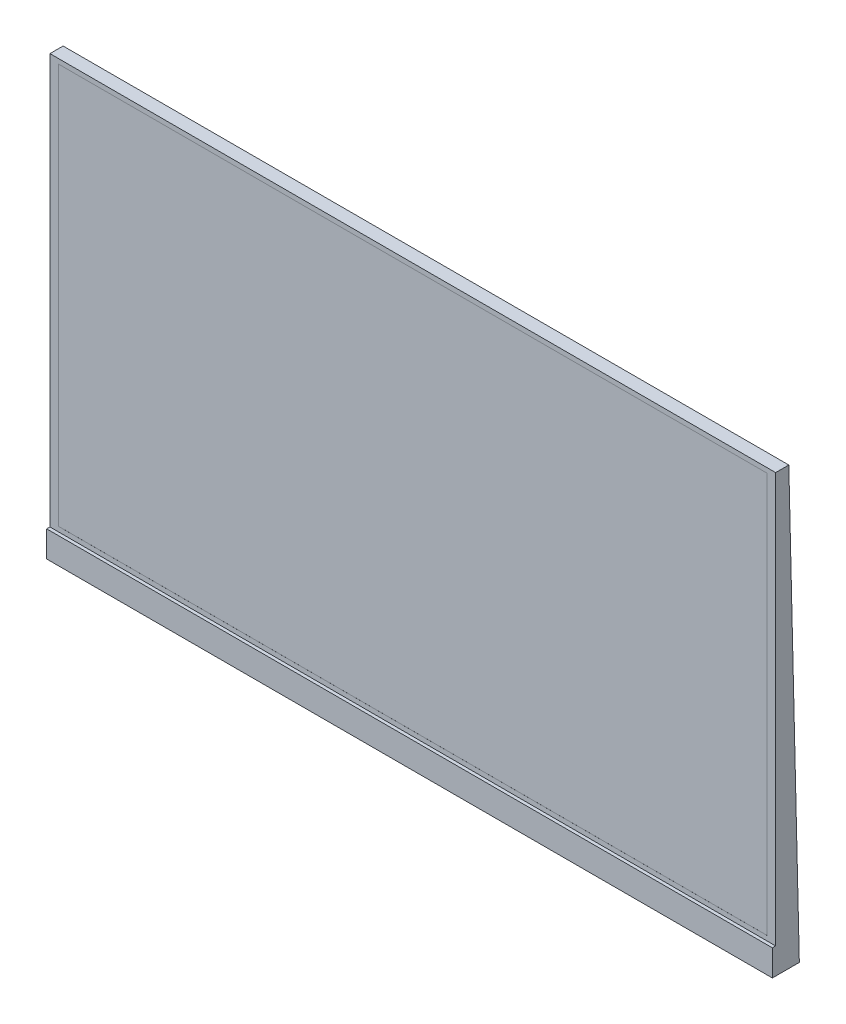
ISO-10303-21;
HEADER;
FILE_DESCRIPTION(('STEP AP214'),'2;1');
FILE_NAME('part.step','',(''),(''),'','','');
FILE_SCHEMA(('AUTOMOTIVE_DESIGN { 1 0 10303 214 1 1 1 1 }'));
ENDSEC;
DATA;
#1=APPLICATION_CONTEXT('core data for automotive mechanical design processes');
#2=APPLICATION_PROTOCOL_DEFINITION('international standard','automotive_design',2000,#1);
#3=PRODUCT_CONTEXT('',#1,'mechanical');
#4=PRODUCT('Part','Part','',(#3));
#5=PRODUCT_RELATED_PRODUCT_CATEGORY('part','',(#4));
#6=PRODUCT_DEFINITION_FORMATION('','',#4);
#7=PRODUCT_DEFINITION_CONTEXT('part definition',#1,'design');
#8=PRODUCT_DEFINITION('design','',#6,#7);
#9=PRODUCT_DEFINITION_SHAPE('','',#8);
#10=(LENGTH_UNIT() NAMED_UNIT(*) SI_UNIT(.MILLI.,.METRE.));
#11=(NAMED_UNIT(*) PLANE_ANGLE_UNIT() SI_UNIT($,.RADIAN.));
#12=(NAMED_UNIT(*) SI_UNIT($,.STERADIAN.) SOLID_ANGLE_UNIT());
#13=UNCERTAINTY_MEASURE_WITH_UNIT(LENGTH_MEASURE(1.E-05),#10,'distance_accuracy_value','');
#14=(GEOMETRIC_REPRESENTATION_CONTEXT(3) GLOBAL_UNCERTAINTY_ASSIGNED_CONTEXT((#13)) GLOBAL_UNIT_ASSIGNED_CONTEXT((#10,
#11,#12)) REPRESENTATION_CONTEXT('',''));
#15=CARTESIAN_POINT('',(0.,0.,0.));
#16=DIRECTION('',(0.,0.,1.));
#17=DIRECTION('',(1.,0.,0.));
#18=AXIS2_PLACEMENT_3D('',#15,#16,#17);
#19=CARTESIAN_POINT('',(269.478125,-161.925,9.525));
#20=DIRECTION('',(-1.,0.,0.));
#21=DIRECTION('',(0.,0.,1.));
#22=AXIS2_PLACEMENT_3D('',#19,#20,#21);
#23=PLANE('',#22);
#24=DIRECTION('',(0.,0.999709445349068,0.0241044576761122));
#25=VECTOR('',#24,1.);
#26=CARTESIAN_POINT('',(269.478125,161.925,-0.253999999999999));
#27=LINE('',#26,#25);
#28=CARTESIAN_POINT('',(269.478125,-161.925,-8.06249741364926));
#29=VERTEX_POINT('',#28);
#30=CARTESIAN_POINT('',(269.478125,161.925,-0.253999999999999));
#31=VERTEX_POINT('',#30);
#32=EDGE_CURVE('E229',#29,#31,#27,.T.);
#33=ORIENTED_EDGE('',*,*,#32,.T.);
#34=DIRECTION('',(0.,0.,-1.));
#35=VECTOR('',#34,1.);
#36=CARTESIAN_POINT('',(269.478125,161.925,9.525));
#37=LINE('',#36,#35);
#38=CARTESIAN_POINT('',(269.478125,161.925,9.525));
#39=VERTEX_POINT('',#38);
#40=EDGE_CURVE('E258',#39,#31,#37,.T.);
#41=ORIENTED_EDGE('',*,*,#40,.F.);
#42=DIRECTION('',(0.,1.,0.));
#43=VECTOR('',#42,1.);
#44=CARTESIAN_POINT('',(269.478125,-161.925,9.525));
#45=LINE('',#44,#43);
#46=CARTESIAN_POINT('',(269.478125,-142.5194,9.525));
#47=VERTEX_POINT('',#46);
#48=EDGE_CURVE('E245',#47,#39,#45,.T.);
#49=ORIENTED_EDGE('',*,*,#48,.F.);
#50=DIRECTION('',(0.,0.,1.));
#51=VECTOR('',#50,1.);
#52=CARTESIAN_POINT('',(269.478125,-142.5194,11.9527025863507));
#53=LINE('',#52,#51);
#54=CARTESIAN_POINT('',(269.478125,-142.5194,11.9527025863507));
#55=VERTEX_POINT('',#54);
#56=EDGE_CURVE('E215',#47,#55,#53,.T.);
#57=ORIENTED_EDGE('',*,*,#56,.T.);
#58=DIRECTION('',(0.,-1.,0.));
#59=VECTOR('',#58,1.);
#60=CARTESIAN_POINT('',(269.478125,-161.925,11.9527025863507));
#61=LINE('',#60,#59);
#62=CARTESIAN_POINT('',(269.478125,-161.925,11.9527025863507));
#63=VERTEX_POINT('',#62);
#64=EDGE_CURVE('E226',#55,#63,#61,.T.);
#65=ORIENTED_EDGE('',*,*,#64,.T.);
#66=DIRECTION('',(0.,0.,-1.));
#67=VECTOR('',#66,1.);
#68=CARTESIAN_POINT('',(269.478125,-161.925,9.525));
#69=LINE('',#68,#67);
#70=EDGE_CURVE('E251',#63,#29,#69,.T.);
#71=ORIENTED_EDGE('',*,*,#70,.T.);
#72=EDGE_LOOP('',(#33,#41,#49,#57,#65,#71));
#73=FACE_BOUND('',#72,.T.);
#74=ADVANCED_FACE('F35',(#73),#23,.F.);
#75=CARTESIAN_POINT('',(-269.478125,-161.925,9.525));
#76=DIRECTION('',(1.,0.,0.));
#77=DIRECTION('',(0.,0.,-1.));
#78=AXIS2_PLACEMENT_3D('',#75,#76,#77);
#79=PLANE('',#78);
#80=DIRECTION('',(0.,-0.999709445349068,-0.0241044576761122));
#81=VECTOR('',#80,1.);
#82=CARTESIAN_POINT('',(-269.478125,161.925,-0.253999999999999));
#83=LINE('',#82,#81);
#84=CARTESIAN_POINT('',(-269.478125,161.925,-0.253999999999999));
#85=VERTEX_POINT('',#84);
#86=CARTESIAN_POINT('',(-269.478125,-161.925,-8.06249741364926));
#87=VERTEX_POINT('',#86);
#88=EDGE_CURVE('E220',#85,#87,#83,.T.);
#89=ORIENTED_EDGE('',*,*,#88,.T.);
#90=DIRECTION('',(0.,0.,-1.));
#91=VECTOR('',#90,1.);
#92=CARTESIAN_POINT('',(-269.478125,-161.925,9.525));
#93=LINE('',#92,#91);
#94=CARTESIAN_POINT('',(-269.478125,-161.925,11.9527025863507));
#95=VERTEX_POINT('',#94);
#96=EDGE_CURVE('E253',#95,#87,#93,.T.);
#97=ORIENTED_EDGE('',*,*,#96,.F.);
#98=DIRECTION('',(0.,1.,0.));
#99=VECTOR('',#98,1.);
#100=CARTESIAN_POINT('',(-269.478125,-161.925,11.9527025863507));
#101=LINE('',#100,#99);
#102=CARTESIAN_POINT('',(-269.478125,-142.5194,11.9527025863507));
#103=VERTEX_POINT('',#102);
#104=EDGE_CURVE('E218',#95,#103,#101,.T.);
#105=ORIENTED_EDGE('',*,*,#104,.T.);
#106=DIRECTION('',(0.,0.,-1.));
#107=VECTOR('',#106,1.);
#108=CARTESIAN_POINT('',(-269.478125,-142.5194,11.9527025863507));
#109=LINE('',#108,#107);
#110=CARTESIAN_POINT('',(-269.478125,-142.5194,9.525));
#111=VERTEX_POINT('',#110);
#112=EDGE_CURVE('E223',#103,#111,#109,.T.);
#113=ORIENTED_EDGE('',*,*,#112,.T.);
#114=DIRECTION('',(0.,-1.,0.));
#115=VECTOR('',#114,1.);
#116=CARTESIAN_POINT('',(-269.478125,-161.925,9.525));
#117=LINE('',#116,#115);
#118=CARTESIAN_POINT('',(-269.478125,161.925,9.525));
#119=VERTEX_POINT('',#118);
#120=EDGE_CURVE('E249',#119,#111,#117,.T.);
#121=ORIENTED_EDGE('',*,*,#120,.F.);
#122=DIRECTION('',(0.,0.,-1.));
#123=VECTOR('',#122,1.);
#124=CARTESIAN_POINT('',(-269.478125,161.925,9.525));
#125=LINE('',#124,#123);
#126=EDGE_CURVE('E256',#119,#85,#125,.T.);
#127=ORIENTED_EDGE('',*,*,#126,.T.);
#128=EDGE_LOOP('',(#89,#97,#105,#113,#121,#127));
#129=FACE_BOUND('',#128,.T.);
#130=ADVANCED_FACE('F340',(#129),#79,.F.);
#131=CARTESIAN_POINT('',(-437.651403620272,78.3717,-37.1935923327215));
#132=DIRECTION('',(0.,0.995848241580805,-0.0910290049402883));
#133=DIRECTION('',(0.,0.0910290049402883,0.995848241580805));
#134=AXIS2_PLACEMENT_3D('',#131,#132,#133);
#135=PLANE('',#134);
#136=CARTESIAN_POINT('',(-158.765875,79.8255081958881,-21.2890755644605));
#137=DIRECTION('',(0.,0.995848241580805,-0.0910290049402883));
#138=DIRECTION('',(0.,0.0910290049402883,0.995848241580805));
#139=AXIS2_PLACEMENT_3D('',#136,#137,#138);
#140=ELLIPSE('',#139,19.177247008656,19.05);
#141=CARTESIAN_POINT('',(-139.715875,79.8255081958881,-21.2890755644605));
#142=VERTEX_POINT('',#141);
#143=CARTESIAN_POINT('',(-139.842277685109,80.0262741641194,-19.0927158814835));
#144=VERTEX_POINT('',#143);
#145=EDGE_CURVE('E284',#142,#144,#140,.F.);
#146=ORIENTED_EDGE('',*,*,#145,.T.);
#147=DIRECTION('',(1.,0.,0.));
#148=VECTOR('',#147,1.);
#149=CARTESIAN_POINT('',(139.684125,80.0262741641194,-19.0927158814835));
#150=LINE('',#149,#148);
#151=CARTESIAN_POINT('',(139.810527685109,80.0262741641194,-19.0927158814835));
#152=VERTEX_POINT('',#151);
#153=EDGE_CURVE('E59',#144,#152,#150,.T.);
#154=ORIENTED_EDGE('',*,*,#153,.T.);
#155=CARTESIAN_POINT('',(158.734125,79.8255081958881,-21.2890755644605));
#156=DIRECTION('',(0.,0.995848241580805,-0.0910290049402883));
#157=DIRECTION('',(0.,-0.0910290049402883,-0.995848241580805));
#158=AXIS2_PLACEMENT_3D('',#155,#156,#157);
#159=ELLIPSE('',#158,19.177247008656,19.05);
#160=CARTESIAN_POINT('',(139.684125,79.8255081958881,-21.2890755644605));
#161=VERTEX_POINT('',#160);
#162=EDGE_CURVE('E11',#152,#161,#159,.F.);
#163=ORIENTED_EDGE('',*,*,#162,.T.);
#164=DIRECTION('',(0.,0.0910290049402883,0.995848241580805));
#165=VECTOR('',#164,1.);
#166=CARTESIAN_POINT('',(139.684125,78.3717,-37.1935923327215));
#167=LINE('',#166,#165);
#168=CARTESIAN_POINT('',(139.684125,78.3717,-37.1935923327215));
#169=VERTEX_POINT('',#168);
#170=EDGE_CURVE('E208',#169,#161,#167,.T.);
#171=ORIENTED_EDGE('',*,*,#170,.F.);
#172=DIRECTION('',(1.,0.,0.));
#173=VECTOR('',#172,1.);
#174=CARTESIAN_POINT('',(-437.651403620272,78.3717,-37.1935923327215));
#175=LINE('',#174,#173);
#176=CARTESIAN_POINT('',(-139.715875,78.3717,-37.1935923327215));
#177=VERTEX_POINT('',#176);
#178=EDGE_CURVE('E212',#177,#169,#175,.T.);
#179=ORIENTED_EDGE('',*,*,#178,.F.);
#180=DIRECTION('',(0.,0.0910290049402883,0.995848241580805));
#181=VECTOR('',#180,1.);
#182=CARTESIAN_POINT('',(-139.715875,78.3717,-37.1935923327215));
#183=LINE('',#182,#181);
#184=EDGE_CURVE('E203',#177,#142,#183,.T.);
#185=ORIENTED_EDGE('',*,*,#184,.T.);
#186=EDGE_LOOP('',(#146,#154,#163,#171,#179,#185));
#187=FACE_BOUND('',#186,.T.);
#188=ADVANCED_FACE('F307',(#187),#135,.T.);
#189=CARTESIAN_POINT('',(-437.651403620272,78.3717,-37.1935923327215));
#190=DIRECTION('',(0.,-0.00388871893515446,-0.999992438903937));
#191=DIRECTION('',(0.,0.999992438903937,-0.00388871893515447));
#192=AXIS2_PLACEMENT_3D('',#189,#190,#191);
#193=PLANE('',#192);
#194=DIRECTION('',(0.,0.999992438903937,-0.00388871893515447));
#195=VECTOR('',#194,1.);
#196=CARTESIAN_POINT('',(139.684125,78.3716999999998,-37.1935923327215));
#197=LINE('',#196,#195);
#198=CARTESIAN_POINT('',(139.684125,-80.3770996759999,-36.5762582017657));
#199=VERTEX_POINT('',#198);
#200=EDGE_CURVE('E206',#199,#169,#197,.T.);
#201=ORIENTED_EDGE('',*,*,#200,.F.);
#202=DIRECTION('',(1.,0.,0.));
#203=VECTOR('',#202,1.);
#204=CARTESIAN_POINT('',(-437.651403620272,-80.3770996759999,-36.5762582017657));
#205=LINE('',#204,#203);
#206=CARTESIAN_POINT('',(-139.715875,-80.3770996759999,-36.5762582017657));
#207=VERTEX_POINT('',#206);
#208=EDGE_CURVE('E211',#207,#199,#205,.T.);
#209=ORIENTED_EDGE('',*,*,#208,.F.);
#210=DIRECTION('',(0.,0.999992438903937,-0.00388871893515447));
#211=VECTOR('',#210,1.);
#212=CARTESIAN_POINT('',(-139.715875,78.3716999999999,-37.1935923327215));
#213=LINE('',#212,#211);
#214=EDGE_CURVE('E200',#207,#177,#213,.T.);
#215=ORIENTED_EDGE('',*,*,#214,.T.);
#216=ORIENTED_EDGE('',*,*,#178,.T.);
#217=EDGE_LOOP('',(#201,#209,#215,#216));
#218=FACE_BOUND('',#217,.T.);
#219=ADVANCED_FACE('F315',(#218),#193,.T.);
#220=CARTESIAN_POINT('',(-437.651403620272,-80.3770996759999,-36.5762582017657));
#221=DIRECTION('',(0.,-0.996526089955066,-0.0832811625691415));
#222=DIRECTION('',(0.,0.0832811625691415,-0.996526089955066));
#223=AXIS2_PLACEMENT_3D('',#220,#221,#222);
#224=PLANE('',#223);
#225=DIRECTION('',(0.,0.0832811625691415,-0.996526089955066));
#226=VECTOR('',#225,1.);
#227=CARTESIAN_POINT('',(139.684125,-80.3770996759999,-36.5762582017657));
#228=LINE('',#227,#226);
#229=CARTESIAN_POINT('',(139.684125,-81.3299390109497,-25.1747692272985));
#230=VERTEX_POINT('',#229);
#231=EDGE_CURVE('E263',#230,#199,#228,.T.);
#232=ORIENTED_EDGE('',*,*,#231,.F.);
#233=CARTESIAN_POINT('',(158.734125,-81.3299390109497,-25.1747692272985));
#234=DIRECTION('',(0.,-0.996526089955066,-0.0832811625691415));
#235=DIRECTION('',(0.,-0.0832811625691415,0.996526089955066));
#236=AXIS2_PLACEMENT_3D('',#233,#234,#235);
#237=ELLIPSE('',#236,19.0835107990965,19.05);
#238=CARTESIAN_POINT('',(139.717576953863,-81.4240829935834,-24.0482607587248));
#239=VERTEX_POINT('',#238);
#240=EDGE_CURVE('E44',#230,#239,#237,.F.);
#241=ORIENTED_EDGE('',*,*,#240,.T.);
#242=DIRECTION('',(1.,0.,0.));
#243=VECTOR('',#242,1.);
#244=CARTESIAN_POINT('',(-139.715875,-81.4240829935834,-24.0482607587248));
#245=LINE('',#244,#243);
#246=CARTESIAN_POINT('',(-139.749326953863,-81.4240829935834,-24.0482607587248));
#247=VERTEX_POINT('',#246);
#248=EDGE_CURVE('E277',#239,#247,#245,.F.);
#249=ORIENTED_EDGE('',*,*,#248,.T.);
#250=CARTESIAN_POINT('',(-158.765875,-81.3299390109497,-25.1747692272985));
#251=DIRECTION('',(0.,-0.996526089955066,-0.0832811625691415));
#252=DIRECTION('',(0.,0.0832811625691415,-0.996526089955066));
#253=AXIS2_PLACEMENT_3D('',#250,#251,#252);
#254=ELLIPSE('',#253,19.0835107990965,19.05);
#255=CARTESIAN_POINT('',(-139.715875,-81.3299390109497,-25.1747692272985));
#256=VERTEX_POINT('',#255);
#257=EDGE_CURVE('E282',#247,#256,#254,.F.);
#258=ORIENTED_EDGE('',*,*,#257,.T.);
#259=DIRECTION('',(0.,0.0832811625691415,-0.996526089955066));
#260=VECTOR('',#259,1.);
#261=CARTESIAN_POINT('',(-139.715875,-80.3770996759999,-36.5762582017657));
#262=LINE('',#261,#260);
#263=EDGE_CURVE('E261',#256,#207,#262,.T.);
#264=ORIENTED_EDGE('',*,*,#263,.T.);
#265=ORIENTED_EDGE('',*,*,#208,.T.);
#266=EDGE_LOOP('',(#232,#241,#249,#258,#264,#265));
#267=FACE_BOUND('',#266,.T.);
#268=ADVANCED_FACE('F317',(#267),#224,.T.);
#269=CARTESIAN_POINT('',(-269.478125,161.925,9.525));
#270=DIRECTION('',(0.,-1.,0.));
#271=DIRECTION('',(0.,0.,-1.));
#272=AXIS2_PLACEMENT_3D('',#269,#270,#271);
#273=PLANE('',#272);
#274=ORIENTED_EDGE('',*,*,#40,.T.);
#275=DIRECTION('',(1.,0.,0.));
#276=VECTOR('',#275,1.);
#277=CARTESIAN_POINT('',(-593.946044417375,161.925,-0.253999999999999));
#278=LINE('',#277,#276);
#279=EDGE_CURVE('E221',#85,#31,#278,.T.);
#280=ORIENTED_EDGE('',*,*,#279,.F.);
#281=ORIENTED_EDGE('',*,*,#126,.F.);
#282=DIRECTION('',(-1.,0.,0.));
#283=VECTOR('',#282,1.);
#284=CARTESIAN_POINT('',(-269.478125,161.925,9.525));
#285=LINE('',#284,#283);
#286=EDGE_CURVE('E247',#39,#119,#285,.T.);
#287=ORIENTED_EDGE('',*,*,#286,.F.);
#288=EDGE_LOOP('',(#274,#280,#281,#287));
#289=FACE_BOUND('',#288,.T.);
#290=ADVANCED_FACE('F349',(#289),#273,.F.);
#291=CARTESIAN_POINT('',(-269.478125,-161.925,9.525));
#292=DIRECTION('',(0.,1.,0.));
#293=DIRECTION('',(0.,0.,1.));
#294=AXIS2_PLACEMENT_3D('',#291,#292,#293);
#295=PLANE('',#294);
#296=ORIENTED_EDGE('',*,*,#96,.T.);
#297=DIRECTION('',(1.,0.,0.));
#298=VECTOR('',#297,1.);
#299=CARTESIAN_POINT('',(-593.946044417375,-161.925,-8.06249741364926));
#300=LINE('',#299,#298);
#301=EDGE_CURVE('E234',#87,#29,#300,.T.);
#302=ORIENTED_EDGE('',*,*,#301,.T.);
#303=ORIENTED_EDGE('',*,*,#70,.F.);
#304=DIRECTION('',(1.,0.,0.));
#305=VECTOR('',#304,1.);
#306=CARTESIAN_POINT('',(-593.946044417375,-161.925,11.9527025863507));
#307=LINE('',#306,#305);
#308=EDGE_CURVE('E237',#95,#63,#307,.T.);
#309=ORIENTED_EDGE('',*,*,#308,.F.);
#310=EDGE_LOOP('',(#296,#302,#303,#309));
#311=FACE_BOUND('',#310,.T.);
#312=ADVANCED_FACE('F351',(#311),#295,.F.);
#313=CARTESIAN_POINT('',(0.,0.,9.525));
#314=DIRECTION('',(0.,0.,-1.));
#315=DIRECTION('',(-1.,0.,0.));
#316=AXIS2_PLACEMENT_3D('',#313,#314,#315);
#317=PLANE('',#316);
#318=DIRECTION('',(-1.,0.,0.));
#319=VECTOR('',#318,1.);
#320=CARTESIAN_POINT('',(-263.174603173603,158.364280701682,9.525));
#321=LINE('',#320,#319);
#322=CARTESIAN_POINT('',(263.174603173603,158.364280701682,9.525));
#323=VERTEX_POINT('',#322);
#324=CARTESIAN_POINT('',(-263.174603173603,158.364280701682,9.525));
#325=VERTEX_POINT('',#324);
#326=EDGE_CURVE('E190',#323,#325,#321,.T.);
#327=ORIENTED_EDGE('',*,*,#326,.F.);
#328=DIRECTION('',(0.,1.,0.));
#329=VECTOR('',#328,1.);
#330=CARTESIAN_POINT('',(263.174603173603,-138.958680701682,9.525));
#331=LINE('',#330,#329);
#332=CARTESIAN_POINT('',(263.174603173603,-138.958680701682,9.525));
#333=VERTEX_POINT('',#332);
#334=EDGE_CURVE('E52',#333,#323,#331,.T.);
#335=ORIENTED_EDGE('',*,*,#334,.F.);
#336=DIRECTION('',(1.,0.,0.));
#337=VECTOR('',#336,1.);
#338=CARTESIAN_POINT('',(-263.174603173603,-138.958680701682,9.525));
#339=LINE('',#338,#337);
#340=CARTESIAN_POINT('',(-263.174603173603,-138.958680701682,9.525));
#341=VERTEX_POINT('',#340);
#342=EDGE_CURVE('E181',#341,#333,#339,.T.);
#343=ORIENTED_EDGE('',*,*,#342,.F.);
#344=DIRECTION('',(0.,-1.,0.));
#345=VECTOR('',#344,1.);
#346=CARTESIAN_POINT('',(-263.174603173603,-138.958680701682,9.525));
#347=LINE('',#346,#345);
#348=EDGE_CURVE('E184',#325,#341,#347,.T.);
#349=ORIENTED_EDGE('',*,*,#348,.F.);
#350=EDGE_LOOP('',(#327,#335,#343,#349));
#351=FACE_BOUND('',#350,.T.);
#352=ORIENTED_EDGE('',*,*,#120,.T.);
#353=DIRECTION('',(1.,0.,0.));
#354=VECTOR('',#353,1.);
#355=CARTESIAN_POINT('',(-593.946044417375,-142.5194,9.525));
#356=LINE('',#355,#354);
#357=EDGE_CURVE('E231',#111,#47,#356,.T.);
#358=ORIENTED_EDGE('',*,*,#357,.T.);
#359=ORIENTED_EDGE('',*,*,#48,.T.);
#360=ORIENTED_EDGE('',*,*,#286,.T.);
#361=EDGE_LOOP('',(#352,#358,#359,#360));
#362=FACE_BOUND('',#361,.T.);
#363=ADVANCED_FACE('F356',(#351,#362),#317,.F.);
#364=CARTESIAN_POINT('',(-593.946044417375,161.925,-0.253999999999999));
#365=DIRECTION('',(0.,0.0241044576761122,-0.999709445349068));
#366=DIRECTION('',(0.,0.999709445349068,0.0241044576761122));
#367=AXIS2_PLACEMENT_3D('',#364,#365,#366);
#368=PLANE('',#367);
#369=DIRECTION('',(1.,0.,0.));
#370=VECTOR('',#369,1.);
#371=CARTESIAN_POINT('',(-139.715875,98.5379932475037,-1.78235349169626));
#372=LINE('',#371,#370);
#373=CARTESIAN_POINT('',(158.734125,98.5379932475037,-1.78235349169626));
#374=VERTEX_POINT('',#373);
#375=CARTESIAN_POINT('',(-158.765875,98.5379932475037,-1.78235349169626));
#376=VERTEX_POINT('',#375);
#377=EDGE_CURVE('E265',#374,#376,#372,.F.);
#378=ORIENTED_EDGE('',*,*,#377,.T.);
#379=DIRECTION('',(0.,-0.999709445349068,-0.0241044576761122));
#380=VECTOR('',#379,1.);
#381=CARTESIAN_POINT('',(-158.765875,-82.9192359761992,-6.15755282805953));
#382=LINE('',#381,#380);
#383=CARTESIAN_POINT('',(-158.765875,-100.867094925957,-6.5903019717672));
#384=VERTEX_POINT('',#383);
#385=EDGE_CURVE('E271',#376,#384,#382,.T.);
#386=ORIENTED_EDGE('',*,*,#385,.T.);
#387=DIRECTION('',(1.,0.,0.));
#388=VECTOR('',#387,1.);
#389=CARTESIAN_POINT('',(139.684125,-100.867094925957,-6.5903019717672));
#390=LINE('',#389,#388);
#391=CARTESIAN_POINT('',(158.734125,-100.867094925957,-6.5903019717672));
#392=VERTEX_POINT('',#391);
#393=EDGE_CURVE('E269',#384,#392,#390,.T.);
#394=ORIENTED_EDGE('',*,*,#393,.T.);
#395=DIRECTION('',(0.,-0.999709445349068,-0.0241044576761122));
#396=VECTOR('',#395,1.);
#397=CARTESIAN_POINT('',(158.734125,161.925,-0.254000000000005));
#398=LINE('',#397,#396);
#399=EDGE_CURVE('E267',#392,#374,#398,.F.);
#400=ORIENTED_EDGE('',*,*,#399,.T.);
#401=EDGE_LOOP('',(#378,#386,#394,#400));
#402=FACE_BOUND('',#401,.T.);
#403=ORIENTED_EDGE('',*,*,#279,.T.);
#404=ORIENTED_EDGE('',*,*,#32,.F.);
#405=ORIENTED_EDGE('',*,*,#301,.F.);
#406=ORIENTED_EDGE('',*,*,#88,.F.);
#407=EDGE_LOOP('',(#403,#404,#405,#406));
#408=FACE_BOUND('',#407,.T.);
#409=ADVANCED_FACE('F329',(#402,#408),#368,.T.);
#410=CARTESIAN_POINT('',(-593.946044417375,-161.925,11.9527025863507));
#411=DIRECTION('',(0.,0.,1.));
#412=DIRECTION('',(0.,-1.,0.));
#413=AXIS2_PLACEMENT_3D('',#410,#411,#412);
#414=PLANE('',#413);
#415=ORIENTED_EDGE('',*,*,#104,.F.);
#416=ORIENTED_EDGE('',*,*,#308,.T.);
#417=ORIENTED_EDGE('',*,*,#64,.F.);
#418=DIRECTION('',(1.,0.,0.));
#419=VECTOR('',#418,1.);
#420=CARTESIAN_POINT('',(-593.946044417375,-142.5194,11.9527025863507));
#421=LINE('',#420,#419);
#422=EDGE_CURVE('E240',#103,#55,#421,.T.);
#423=ORIENTED_EDGE('',*,*,#422,.F.);
#424=EDGE_LOOP('',(#415,#416,#417,#423));
#425=FACE_BOUND('',#424,.T.);
#426=ADVANCED_FACE('F364',(#425),#414,.T.);
#427=CARTESIAN_POINT('',(-593.946044417375,-142.5194,11.9527025863507));
#428=DIRECTION('',(0.,1.,0.));
#429=DIRECTION('',(0.,0.,1.));
#430=AXIS2_PLACEMENT_3D('',#427,#428,#429);
#431=PLANE('',#430);
#432=ORIENTED_EDGE('',*,*,#112,.F.);
#433=ORIENTED_EDGE('',*,*,#422,.T.);
#434=ORIENTED_EDGE('',*,*,#56,.F.);
#435=ORIENTED_EDGE('',*,*,#357,.F.);
#436=EDGE_LOOP('',(#432,#433,#434,#435));
#437=FACE_BOUND('',#436,.T.);
#438=ADVANCED_FACE('F361',(#437),#431,.T.);
#439=CARTESIAN_POINT('',(-139.715875,0.990353334518025,-41.0739621713936));
#440=DIRECTION('',(-1.,0.,0.));
#441=DIRECTION('',(0.,-1.,0.));
#442=AXIS2_PLACEMENT_3D('',#439,#440,#441);
#443=PLANE('',#442);
#444=ORIENTED_EDGE('',*,*,#263,.F.);
#445=DIRECTION('',(0.,-0.999709445349068,-0.0241044576761122));
#446=VECTOR('',#445,1.);
#447=CARTESIAN_POINT('',(-139.715875,82.0303838273101,-21.2359127864294));
#448=LINE('',#447,#446);
#449=EDGE_CURVE('E274',#256,#142,#448,.F.);
#450=ORIENTED_EDGE('',*,*,#449,.T.);
#451=ORIENTED_EDGE('',*,*,#184,.F.);
#452=ORIENTED_EDGE('',*,*,#214,.F.);
#453=EDGE_LOOP('',(#444,#450,#451,#452));
#454=FACE_BOUND('',#453,.T.);
#455=ADVANCED_FACE('F323',(#454),#443,.T.);
#456=CARTESIAN_POINT('',(139.684125,0.990353334517954,-41.0739621713936));
#457=DIRECTION('',(-1.,0.,0.));
#458=DIRECTION('',(0.,-1.,0.));
#459=AXIS2_PLACEMENT_3D('',#456,#457,#458);
#460=PLANE('',#459);
#461=ORIENTED_EDGE('',*,*,#170,.T.);
#462=DIRECTION('',(0.,-0.999709445349068,-0.0241044576761122));
#463=VECTOR('',#462,1.);
#464=CARTESIAN_POINT('',(139.684125,0.559393125720649,-23.2002975947691));
#465=LINE('',#464,#463);
#466=EDGE_CURVE('E279',#161,#230,#465,.T.);
#467=ORIENTED_EDGE('',*,*,#466,.T.);
#468=ORIENTED_EDGE('',*,*,#231,.T.);
#469=ORIENTED_EDGE('',*,*,#200,.T.);
#470=EDGE_LOOP('',(#461,#467,#468,#469));
#471=FACE_BOUND('',#470,.T.);
#472=ADVANCED_FACE('F310',(#471),#460,.F.);
#473=CARTESIAN_POINT('',(158.734125,0.559393125720642,-23.2002975947691));
#474=DIRECTION('',(0.,-0.999709445349068,-0.0241044576761122));
#475=DIRECTION('',(0.,0.0241044576761122,-0.999709445349068));
#476=AXIS2_PLACEMENT_3D('',#473,#474,#475);
#477=CYLINDRICAL_SURFACE('',#476,19.05);
#478=ORIENTED_EDGE('',*,*,#466,.F.);
#479=ORIENTED_EDGE('',*,*,#162,.F.);
#480=CARTESIAN_POINT('',(158.734125,98.9971831662337,-20.826818425596));
#481=DIRECTION('',(-0.707106781186547,0.706901328022568,0.0170444254796031));
#482=DIRECTION('',(-0.707106781186548,-0.706901328022568,-0.017044425479603));
#483=AXIS2_PLACEMENT_3D('',#480,#481,#482);
#484=ELLIPSE('',#483,26.9407683632075,19.05);
#485=EDGE_CURVE('E39',#374,#152,#484,.F.);
#486=ORIENTED_EDGE('',*,*,#485,.F.);
#487=ORIENTED_EDGE('',*,*,#399,.F.);
#488=CARTESIAN_POINT('',(158.734125,-100.407905007227,-25.6347669056669));
#489=DIRECTION('',(-0.707106781186548,-0.706901328022568,-0.017044425479603));
#490=DIRECTION('',(0.707106781186547,-0.706901328022568,-0.0170444254796031));
#491=AXIS2_PLACEMENT_3D('',#488,#489,#490);
#492=ELLIPSE('',#491,26.9407683632075,19.05);
#493=EDGE_CURVE('E291',#239,#392,#492,.F.);
#494=ORIENTED_EDGE('',*,*,#493,.F.);
#495=ORIENTED_EDGE('',*,*,#240,.F.);
#496=EDGE_LOOP('',(#478,#479,#486,#487,#494,#495));
#497=FACE_BOUND('',#496,.T.);
#498=ADVANCED_FACE('F37',(#497),#477,.F.);
#499=CARTESIAN_POINT('',(-437.651403620272,98.9971831662337,-20.826818425596));
#500=DIRECTION('',(-1.,0.,0.));
#501=DIRECTION('',(0.,0.,1.));
#502=AXIS2_PLACEMENT_3D('',#499,#500,#501);
#503=CYLINDRICAL_SURFACE('',#502,19.05);
#504=ORIENTED_EDGE('',*,*,#153,.F.);
#505=CARTESIAN_POINT('',(-158.765875,98.9971831662337,-20.826818425596));
#506=DIRECTION('',(-0.707106781186548,-0.706901328022568,-0.0170444254796031));
#507=DIRECTION('',(-0.707106781186547,0.706901328022568,0.0170444254796031));
#508=AXIS2_PLACEMENT_3D('',#505,#506,#507);
#509=ELLIPSE('',#508,26.9407683632075,19.05);
#510=EDGE_CURVE('E289',#376,#144,#509,.F.);
#511=ORIENTED_EDGE('',*,*,#510,.F.);
#512=ORIENTED_EDGE('',*,*,#377,.F.);
#513=ORIENTED_EDGE('',*,*,#485,.T.);
#514=EDGE_LOOP('',(#504,#511,#512,#513));
#515=FACE_BOUND('',#514,.T.);
#516=ADVANCED_FACE('F300',(#515),#503,.F.);
#517=CARTESIAN_POINT('',(-593.946044417375,-100.407905007227,-25.6347669056669));
#518=DIRECTION('',(-1.,0.,0.));
#519=DIRECTION('',(0.,0.,1.));
#520=AXIS2_PLACEMENT_3D('',#517,#518,#519);
#521=CYLINDRICAL_SURFACE('',#520,19.05);
#522=ORIENTED_EDGE('',*,*,#493,.T.);
#523=ORIENTED_EDGE('',*,*,#393,.F.);
#524=CARTESIAN_POINT('',(-158.765875,-100.407905007227,-25.6347669056669));
#525=DIRECTION('',(-0.707106781186547,0.706901328022568,0.0170444254796031));
#526=DIRECTION('',(-0.707106781186548,-0.706901328022568,-0.0170444254796031));
#527=AXIS2_PLACEMENT_3D('',#524,#525,#526);
#528=ELLIPSE('',#527,26.9407683632075,19.05);
#529=EDGE_CURVE('E196',#247,#384,#528,.F.);
#530=ORIENTED_EDGE('',*,*,#529,.F.);
#531=ORIENTED_EDGE('',*,*,#248,.F.);
#532=EDGE_LOOP('',(#522,#523,#530,#531));
#533=FACE_BOUND('',#532,.T.);
#534=ADVANCED_FACE('F331',(#533),#521,.F.);
#535=CARTESIAN_POINT('',(-158.765875,162.38418991873,-19.2984649338997));
#536=DIRECTION('',(0.,0.999709445349068,0.0241044576761122));
#537=DIRECTION('',(0.,-0.0241044576761122,0.999709445349068));
#538=AXIS2_PLACEMENT_3D('',#535,#536,#537);
#539=CYLINDRICAL_SURFACE('',#538,19.05);
#540=ORIENTED_EDGE('',*,*,#145,.F.);
#541=ORIENTED_EDGE('',*,*,#449,.F.);
#542=ORIENTED_EDGE('',*,*,#257,.F.);
#543=ORIENTED_EDGE('',*,*,#529,.T.);
#544=ORIENTED_EDGE('',*,*,#385,.F.);
#545=ORIENTED_EDGE('',*,*,#510,.T.);
#546=EDGE_LOOP('',(#540,#541,#542,#543,#544,#545));
#547=FACE_BOUND('',#546,.T.);
#548=ADVANCED_FACE('F326',(#547),#539,.F.);
#549=CARTESIAN_POINT('',(263.174603173603,-138.958680701682,9.4996));
#550=DIRECTION('',(1.,0.,0.));
#551=DIRECTION('',(0.,0.,-1.));
#552=AXIS2_PLACEMENT_3D('',#549,#550,#551);
#553=PLANE('',#552);
#554=ORIENTED_EDGE('',*,*,#334,.T.);
#555=DIRECTION('',(0.,0.,1.));
#556=VECTOR('',#555,1.);
#557=CARTESIAN_POINT('',(263.174603173603,158.364280701682,9.4996));
#558=LINE('',#557,#556);
#559=CARTESIAN_POINT('',(263.174603173603,158.364280701682,9.4996));
#560=VERTEX_POINT('',#559);
#561=EDGE_CURVE('E159',#560,#323,#558,.T.);
#562=ORIENTED_EDGE('',*,*,#561,.F.);
#563=DIRECTION('',(0.,1.,0.));
#564=VECTOR('',#563,1.);
#565=CARTESIAN_POINT('',(263.174603173603,-138.958680701682,9.4996));
#566=LINE('',#565,#564);
#567=CARTESIAN_POINT('',(263.174603173603,-138.958680701682,9.4996));
#568=VERTEX_POINT('',#567);
#569=EDGE_CURVE('E163',#568,#560,#566,.T.);
#570=ORIENTED_EDGE('',*,*,#569,.F.);
#571=DIRECTION('',(0.,0.,1.));
#572=VECTOR('',#571,1.);
#573=CARTESIAN_POINT('',(263.174603173603,-138.958680701682,9.4996));
#574=LINE('',#573,#572);
#575=EDGE_CURVE('E194',#568,#333,#574,.T.);
#576=ORIENTED_EDGE('',*,*,#575,.T.);
#577=EDGE_LOOP('',(#554,#562,#570,#576));
#578=FACE_BOUND('',#577,.T.);
#579=ADVANCED_FACE('F161',(#578),#553,.F.);
#580=CARTESIAN_POINT('',(-263.174603173603,-138.958680701682,9.4996));
#581=DIRECTION('',(0.,-1.,0.));
#582=DIRECTION('',(0.,0.,-1.));
#583=AXIS2_PLACEMENT_3D('',#580,#581,#582);
#584=PLANE('',#583);
#585=ORIENTED_EDGE('',*,*,#342,.T.);
#586=ORIENTED_EDGE('',*,*,#575,.F.);
#587=DIRECTION('',(1.,0.,0.));
#588=VECTOR('',#587,1.);
#589=CARTESIAN_POINT('',(-263.174603173603,-138.958680701682,9.4996));
#590=LINE('',#589,#588);
#591=CARTESIAN_POINT('',(-263.174603173603,-138.958680701682,9.4996));
#592=VERTEX_POINT('',#591);
#593=EDGE_CURVE('E169',#592,#568,#590,.T.);
#594=ORIENTED_EDGE('',*,*,#593,.F.);
#595=DIRECTION('',(0.,0.,1.));
#596=VECTOR('',#595,1.);
#597=CARTESIAN_POINT('',(-263.174603173603,-138.958680701682,9.4996));
#598=LINE('',#597,#596);
#599=EDGE_CURVE('E197',#592,#341,#598,.T.);
#600=ORIENTED_EDGE('',*,*,#599,.T.);
#601=EDGE_LOOP('',(#585,#586,#594,#600));
#602=FACE_BOUND('',#601,.T.);
#603=ADVANCED_FACE('F383',(#602),#584,.F.);
#604=CARTESIAN_POINT('',(-263.174603173603,-138.958680701682,9.4996));
#605=DIRECTION('',(-1.,0.,0.));
#606=DIRECTION('',(0.,0.,1.));
#607=AXIS2_PLACEMENT_3D('',#604,#605,#606);
#608=PLANE('',#607);
#609=ORIENTED_EDGE('',*,*,#348,.T.);
#610=ORIENTED_EDGE('',*,*,#599,.F.);
#611=DIRECTION('',(0.,-1.,0.));
#612=VECTOR('',#611,1.);
#613=CARTESIAN_POINT('',(-263.174603173603,-138.958680701682,9.4996));
#614=LINE('',#613,#612);
#615=CARTESIAN_POINT('',(-263.174603173603,158.364280701682,9.4996));
#616=VERTEX_POINT('',#615);
#617=EDGE_CURVE('E177',#616,#592,#614,.T.);
#618=ORIENTED_EDGE('',*,*,#617,.F.);
#619=DIRECTION('',(0.,0.,1.));
#620=VECTOR('',#619,1.);
#621=CARTESIAN_POINT('',(-263.174603173603,158.364280701682,9.4996));
#622=LINE('',#621,#620);
#623=EDGE_CURVE('E168',#616,#325,#622,.T.);
#624=ORIENTED_EDGE('',*,*,#623,.T.);
#625=EDGE_LOOP('',(#609,#610,#618,#624));
#626=FACE_BOUND('',#625,.T.);
#627=ADVANCED_FACE('F386',(#626),#608,.F.);
#628=CARTESIAN_POINT('',(-263.174603173603,158.364280701682,9.4996));
#629=DIRECTION('',(0.,1.,0.));
#630=DIRECTION('',(0.,0.,1.));
#631=AXIS2_PLACEMENT_3D('',#628,#629,#630);
#632=PLANE('',#631);
#633=ORIENTED_EDGE('',*,*,#326,.T.);
#634=ORIENTED_EDGE('',*,*,#623,.F.);
#635=DIRECTION('',(-1.,0.,0.));
#636=VECTOR('',#635,1.);
#637=CARTESIAN_POINT('',(-263.174603173603,158.364280701682,9.4996));
#638=LINE('',#637,#636);
#639=EDGE_CURVE('E172',#560,#616,#638,.T.);
#640=ORIENTED_EDGE('',*,*,#639,.F.);
#641=ORIENTED_EDGE('',*,*,#561,.T.);
#642=EDGE_LOOP('',(#633,#634,#640,#641));
#643=FACE_BOUND('',#642,.T.);
#644=ADVANCED_FACE('F173',(#643),#632,.F.);
#645=CARTESIAN_POINT('',(0.,0.,9.4996));
#646=DIRECTION('',(0.,0.,-1.));
#647=DIRECTION('',(-1.,0.,0.));
#648=AXIS2_PLACEMENT_3D('',#645,#646,#647);
#649=PLANE('',#648);
#650=ORIENTED_EDGE('',*,*,#569,.T.);
#651=ORIENTED_EDGE('',*,*,#639,.T.);
#652=ORIENTED_EDGE('',*,*,#617,.T.);
#653=ORIENTED_EDGE('',*,*,#593,.T.);
#654=EDGE_LOOP('',(#650,#651,#652,#653));
#655=FACE_BOUND('',#654,.T.);
#656=ADVANCED_FACE('F179',(#655),#649,.F.);
#657=CLOSED_SHELL('',(#74,#130,#188,#219,#268,#290,#312,#363,#409,#426,#438,#455,#472,#498,#516,
#534,#548,#579,#603,#627,#644,#656));
#658=MANIFOLD_SOLID_BREP('B2',#657);
#659=ADVANCED_BREP_SHAPE_REPRESENTATION('',(#18,#658),#14);
#660=SHAPE_DEFINITION_REPRESENTATION(#9,#659);
ENDSEC;
END-ISO-10303-21;
